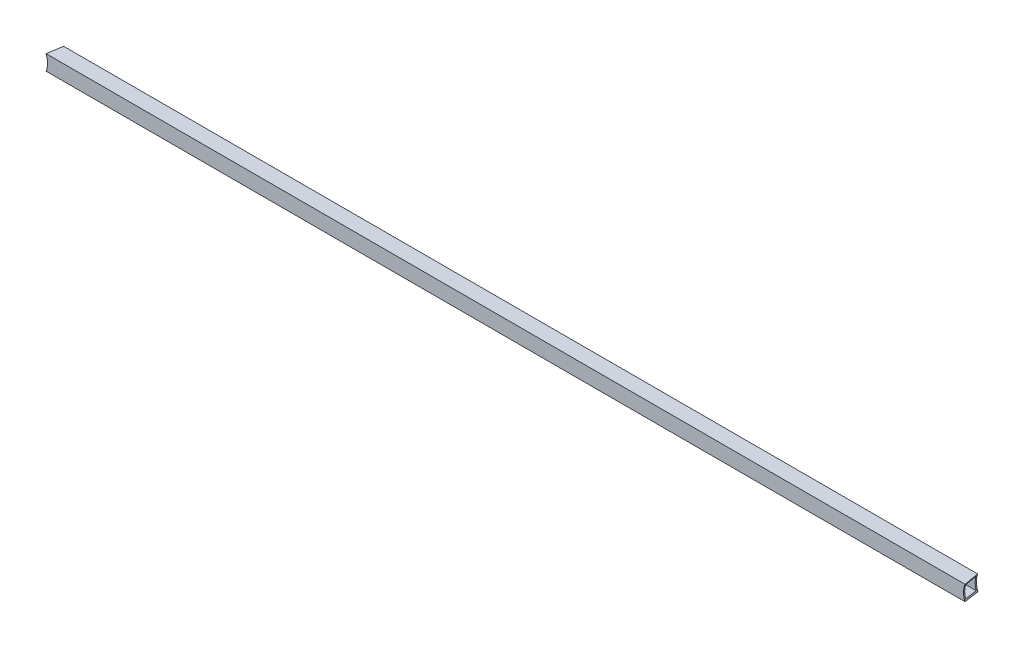
ISO-10303-21;
HEADER;
FILE_DESCRIPTION(('STEP AP214'),'2;1');
FILE_NAME('part.step','',(''),(''),'','','');
FILE_SCHEMA(('AUTOMOTIVE_DESIGN { 1 0 10303 214 1 1 1 1 }'));
ENDSEC;
DATA;
#1=APPLICATION_CONTEXT('core data for automotive mechanical design processes');
#2=APPLICATION_PROTOCOL_DEFINITION('international standard','automotive_design',2000,#1);
#3=PRODUCT_CONTEXT('',#1,'mechanical');
#4=PRODUCT('Part','Part','',(#3));
#5=PRODUCT_RELATED_PRODUCT_CATEGORY('part','',(#4));
#6=PRODUCT_DEFINITION_FORMATION('','',#4);
#7=PRODUCT_DEFINITION_CONTEXT('part definition',#1,'design');
#8=PRODUCT_DEFINITION('design','',#6,#7);
#9=PRODUCT_DEFINITION_SHAPE('','',#8);
#10=(LENGTH_UNIT() NAMED_UNIT(*) SI_UNIT(.MILLI.,.METRE.));
#11=(NAMED_UNIT(*) PLANE_ANGLE_UNIT() SI_UNIT($,.RADIAN.));
#12=(NAMED_UNIT(*) SI_UNIT($,.STERADIAN.) SOLID_ANGLE_UNIT());
#13=UNCERTAINTY_MEASURE_WITH_UNIT(LENGTH_MEASURE(1.E-05),#10,'distance_accuracy_value','');
#14=(GEOMETRIC_REPRESENTATION_CONTEXT(3) GLOBAL_UNCERTAINTY_ASSIGNED_CONTEXT((#13)) GLOBAL_UNIT_ASSIGNED_CONTEXT((#10,
#11,#12)) REPRESENTATION_CONTEXT('',''));
#15=CARTESIAN_POINT('',(0.,0.,0.));
#16=DIRECTION('',(0.,0.,1.));
#17=DIRECTION('',(1.,0.,0.));
#18=AXIS2_PLACEMENT_3D('',#15,#16,#17);
#19=CARTESIAN_POINT('',(299.314079561146,352.955591655442,-564.520506465781));
#20=DIRECTION('',(0.,1.,0.));
#21=DIRECTION('',(0.,0.,1.));
#22=AXIS2_PLACEMENT_3D('',#19,#20,#21);
#23=PLANE('',#22);
#24=DIRECTION('',(-1.,0.,0.));
#25=VECTOR('',#24,1.);
#26=CARTESIAN_POINT('',(299.314079561146,352.955591655442,-556.773506465781));
#27=LINE('',#26,#25);
#28=CARTESIAN_POINT('',(287.650058347241,352.955591655442,-556.773506465781));
#29=VERTEX_POINT('',#28);
#30=CARTESIAN_POINT('',(-287.650058347241,352.955591655442,-556.773506465781));
#31=VERTEX_POINT('',#30);
#32=EDGE_CURVE('E147',#29,#31,#27,.T.);
#33=ORIENTED_EDGE('',*,*,#32,.F.);
#34=CARTESIAN_POINT('',(318.393853823521,352.955591655442,-435.894318112521));
#35=DIRECTION('',(0.,1.,0.));
#36=DIRECTION('',(0.151182856522685,0.,0.988505813788488));
#37=AXIS2_PLACEMENT_3D('',#34,#35,#36);
#38=ELLIPSE('',#37,413.976138648436,12.7);
#39=CARTESIAN_POINT('',(286.544222694846,352.955591655442,-564.520506465781));
#40=VERTEX_POINT('',#39);
#41=EDGE_CURVE('E47',#29,#40,#38,.F.);
#42=ORIENTED_EDGE('',*,*,#41,.T.);
#43=DIRECTION('',(-1.,0.,0.));
#44=VECTOR('',#43,1.);
#45=CARTESIAN_POINT('',(299.314079561146,352.955591655442,-564.520506465781));
#46=LINE('',#45,#44);
#47=CARTESIAN_POINT('',(-286.544222694846,352.955591655442,-564.520506465781));
#48=VERTEX_POINT('',#47);
#49=EDGE_CURVE('E114',#40,#48,#46,.T.);
#50=ORIENTED_EDGE('',*,*,#49,.T.);
#51=CARTESIAN_POINT('',(-318.393853823522,352.955591655442,-435.894318112517));
#52=DIRECTION('',(0.,1.,0.));
#53=DIRECTION('',(-0.151182856522685,0.,0.988505813788488));
#54=AXIS2_PLACEMENT_3D('',#51,#52,#53);
#55=ELLIPSE('',#54,413.976138648436,12.7);
#56=EDGE_CURVE('E103',#48,#31,#55,.F.);
#57=ORIENTED_EDGE('',*,*,#56,.T.);
#58=EDGE_LOOP('',(#33,#42,#50,#57));
#59=FACE_BOUND('',#58,.T.);
#60=ADVANCED_FACE('F43',(#59),#23,.T.);
#61=CARTESIAN_POINT('',(299.314079561146,352.955591655442,-564.520506465781));
#62=DIRECTION('',(0.,0.,1.));
#63=DIRECTION('',(1.,0.,0.));
#64=AXIS2_PLACEMENT_3D('',#61,#62,#63);
#65=PLANE('',#64);
#66=ORIENTED_EDGE('',*,*,#49,.F.);
#67=CARTESIAN_POINT('',(298.721663425022,356.949361626759,-564.520506465781));
#68=DIRECTION('',(0.,0.,1.));
#69=DIRECTION('',(0.980008146933979,-0.198957362123219,0.));
#70=AXIS2_PLACEMENT_3D('',#67,#68,#69);
#71=ELLIPSE('',#70,12.8537235888175,12.7);
#72=CARTESIAN_POINT('',(286.429614297048,360.702591655442,-564.520506465781));
#73=VERTEX_POINT('',#72);
#74=EDGE_CURVE('E113',#40,#73,#71,.F.);
#75=ORIENTED_EDGE('',*,*,#74,.T.);
#76=DIRECTION('',(-1.,0.,0.));
#77=VECTOR('',#76,1.);
#78=CARTESIAN_POINT('',(299.314079561146,360.702591655442,-564.520506465781));
#79=LINE('',#78,#77);
#80=CARTESIAN_POINT('',(-286.429614297048,360.702591655442,-564.520506465781));
#81=VERTEX_POINT('',#80);
#82=EDGE_CURVE('E122',#73,#81,#79,.T.);
#83=ORIENTED_EDGE('',*,*,#82,.T.);
#84=CARTESIAN_POINT('',(-298.721663425022,356.94936162676,-564.520506465781));
#85=DIRECTION('',(0.,0.,1.));
#86=DIRECTION('',(-0.980008146933979,-0.198957362123218,0.));
#87=AXIS2_PLACEMENT_3D('',#84,#85,#86);
#88=ELLIPSE('',#87,12.8537235888175,12.7);
#89=EDGE_CURVE('E99',#81,#48,#88,.F.);
#90=ORIENTED_EDGE('',*,*,#89,.T.);
#91=EDGE_LOOP('',(#66,#75,#83,#90));
#92=FACE_BOUND('',#91,.T.);
#93=ADVANCED_FACE('F119',(#92),#65,.T.);
#94=CARTESIAN_POINT('',(299.314079561146,360.702591655442,-564.520506465781));
#95=DIRECTION('',(0.,-1.,0.));
#96=DIRECTION('',(0.,0.,-1.));
#97=AXIS2_PLACEMENT_3D('',#94,#95,#96);
#98=PLANE('',#97);
#99=ORIENTED_EDGE('',*,*,#82,.F.);
#100=CARTESIAN_POINT('',(280.23430529877,360.702591655442,-685.399694819043));
#101=DIRECTION('',(0.,-1.,0.));
#102=DIRECTION('',(0.151182856522685,0.,0.988505813788488));
#103=AXIS2_PLACEMENT_3D('',#100,#101,#102);
#104=ELLIPSE('',#103,413.976138648436,12.7);
#105=CARTESIAN_POINT('',(287.691160873661,360.702591655442,-556.773506465781));
#106=VERTEX_POINT('',#105);
#107=EDGE_CURVE('E124',#73,#106,#104,.F.);
#108=ORIENTED_EDGE('',*,*,#107,.T.);
#109=DIRECTION('',(-1.,0.,0.));
#110=VECTOR('',#109,1.);
#111=CARTESIAN_POINT('',(299.314079561146,360.702591655442,-556.773506465781));
#112=LINE('',#111,#110);
#113=CARTESIAN_POINT('',(-287.691160873661,360.702591655442,-556.773506465781));
#114=VERTEX_POINT('',#113);
#115=EDGE_CURVE('E138',#106,#114,#112,.T.);
#116=ORIENTED_EDGE('',*,*,#115,.T.);
#117=CARTESIAN_POINT('',(-280.234305298771,360.702591655442,-685.399694819039));
#118=DIRECTION('',(0.,-1.,0.));
#119=DIRECTION('',(-0.151182856522685,0.,0.988505813788488));
#120=AXIS2_PLACEMENT_3D('',#117,#118,#119);
#121=ELLIPSE('',#120,413.976138648436,12.7);
#122=EDGE_CURVE('E142',#114,#81,#121,.F.);
#123=ORIENTED_EDGE('',*,*,#122,.T.);
#124=EDGE_LOOP('',(#99,#108,#116,#123));
#125=FACE_BOUND('',#124,.T.);
#126=ADVANCED_FACE('F222',(#125),#98,.T.);
#127=CARTESIAN_POINT('',(299.314079561146,352.955591655442,-556.773506465781));
#128=DIRECTION('',(0.,0.,-1.));
#129=DIRECTION('',(-1.,0.,0.));
#130=AXIS2_PLACEMENT_3D('',#127,#128,#129);
#131=PLANE('',#130);
#132=ORIENTED_EDGE('',*,*,#115,.F.);
#133=CARTESIAN_POINT('',(299.90649569727,356.708821684125,-556.773506465781));
#134=DIRECTION('',(0.,0.,-1.));
#135=DIRECTION('',(0.980008146933979,-0.198957362123219,0.));
#136=AXIS2_PLACEMENT_3D('',#133,#134,#135);
#137=ELLIPSE('',#136,12.8537235888175,12.7);
#138=EDGE_CURVE('E143',#106,#29,#137,.F.);
#139=ORIENTED_EDGE('',*,*,#138,.T.);
#140=ORIENTED_EDGE('',*,*,#32,.T.);
#141=CARTESIAN_POINT('',(-299.90649569727,356.708821684125,-556.773506465781));
#142=DIRECTION('',(0.,0.,-1.));
#143=DIRECTION('',(-0.980008146933979,-0.198957362123218,0.));
#144=AXIS2_PLACEMENT_3D('',#141,#142,#143);
#145=ELLIPSE('',#144,12.8537235888175,12.7);
#146=EDGE_CURVE('E107',#31,#114,#145,.F.);
#147=ORIENTED_EDGE('',*,*,#146,.T.);
#148=EDGE_LOOP('',(#132,#139,#140,#147));
#149=FACE_BOUND('',#148,.T.);
#150=ADVANCED_FACE('F228',(#149),#131,.T.);
#151=CARTESIAN_POINT('',(-268.329604576393,363.119436719435,-763.238321143161));
#152=DIRECTION('',(-0.151111697234675,-0.0306780966687196,0.98804054033407));
#153=DIRECTION('',(0.988505813788488,0.,0.151182856522685));
#154=AXIS2_PLACEMENT_3D('',#151,#152,#153);
#155=CYLINDRICAL_SURFACE('',#154,12.7);
#156=ORIENTED_EDGE('',*,*,#56,.F.);
#157=ORIENTED_EDGE('',*,*,#89,.F.);
#158=ORIENTED_EDGE('',*,*,#122,.F.);
#159=ORIENTED_EDGE('',*,*,#146,.F.);
#160=EDGE_LOOP('',(#156,#157,#158,#159));
#161=FACE_BOUND('',#160,.T.);
#162=CARTESIAN_POINT('',(-298.585699065912,356.976964570996,-565.409506465781));
#163=DIRECTION('',(0.,0.,1.));
#164=DIRECTION('',(-0.980008146933979,-0.198957362123218,0.));
#165=AXIS2_PLACEMENT_3D('',#162,#163,#164);
#166=ELLIPSE('',#165,12.8537235888175,12.7);
#167=CARTESIAN_POINT('',(-286.593524044193,361.591591655442,-565.409506465781));
#168=VERTEX_POINT('',#167);
#169=CARTESIAN_POINT('',(-286.759621918319,352.066591655442,-565.409506465781));
#170=VERTEX_POINT('',#169);
#171=EDGE_CURVE('E178',#168,#170,#166,.F.);
#172=ORIENTED_EDGE('',*,*,#171,.T.);
#173=CARTESIAN_POINT('',(-322.77281840833,352.066591655442,-407.262553572423));
#174=DIRECTION('',(0.,1.,0.));
#175=DIRECTION('',(-0.151182856522685,0.,0.988505813788488));
#176=AXIS2_PLACEMENT_3D('',#173,#174,#175);
#177=ELLIPSE('',#176,413.976138648436,12.7);
#178=CARTESIAN_POINT('',(-288.094070007544,352.066591655442,-555.884506465781));
#179=VERTEX_POINT('',#178);
#180=EDGE_CURVE('E179',#170,#179,#177,.F.);
#181=ORIENTED_EDGE('',*,*,#180,.T.);
#182=CARTESIAN_POINT('',(-300.04246005638,356.681218739888,-555.884506465781));
#183=DIRECTION('',(0.,0.,-1.));
#184=DIRECTION('',(-0.980008146933979,-0.198957362123218,0.));
#185=AXIS2_PLACEMENT_3D('',#182,#183,#184);
#186=ELLIPSE('',#185,12.8537235888175,12.7);
#187=CARTESIAN_POINT('',(-288.169791810306,361.591591655442,-555.884506465781));
#188=VERTEX_POINT('',#187);
#189=EDGE_CURVE('E182',#179,#188,#186,.F.);
#190=ORIENTED_EDGE('',*,*,#189,.T.);
#191=CARTESIAN_POINT('',(-275.855340713963,361.591591655442,-714.031459359133));
#192=DIRECTION('',(0.,-1.,0.));
#193=DIRECTION('',(-0.151182856522685,0.,0.988505813788488));
#194=AXIS2_PLACEMENT_3D('',#191,#192,#193);
#195=ELLIPSE('',#194,413.976138648436,12.7);
#196=EDGE_CURVE('E154',#188,#168,#195,.F.);
#197=ORIENTED_EDGE('',*,*,#196,.T.);
#198=EDGE_LOOP('',(#172,#181,#190,#197));
#199=FACE_BOUND('',#198,.T.);
#200=ADVANCED_FACE('F104',(#161,#199),#155,.F.);
#201=CARTESIAN_POINT('',(268.329604576393,363.119436719435,-763.238321143161));
#202=DIRECTION('',(0.151111697234675,-0.0306780966687196,0.98804054033407));
#203=DIRECTION('',(0.988505813788488,0.,-0.151182856522685));
#204=AXIS2_PLACEMENT_3D('',#201,#202,#203);
#205=CYLINDRICAL_SURFACE('',#204,12.7);
#206=ORIENTED_EDGE('',*,*,#107,.F.);
#207=ORIENTED_EDGE('',*,*,#74,.F.);
#208=ORIENTED_EDGE('',*,*,#41,.F.);
#209=ORIENTED_EDGE('',*,*,#138,.F.);
#210=EDGE_LOOP('',(#206,#207,#208,#209));
#211=FACE_BOUND('',#210,.T.);
#212=CARTESIAN_POINT('',(298.585699065912,356.976964570996,-565.409506465781));
#213=DIRECTION('',(0.,0.,1.));
#214=DIRECTION('',(0.980008146933979,-0.198957362123219,0.));
#215=AXIS2_PLACEMENT_3D('',#212,#213,#214);
#216=ELLIPSE('',#215,12.8537235888175,12.7);
#217=CARTESIAN_POINT('',(286.75962191832,352.066591655442,-565.409506465781));
#218=VERTEX_POINT('',#217);
#219=CARTESIAN_POINT('',(286.593524044193,361.591591655442,-565.409506465781));
#220=VERTEX_POINT('',#219);
#221=EDGE_CURVE('E150',#218,#220,#216,.F.);
#222=ORIENTED_EDGE('',*,*,#221,.T.);
#223=CARTESIAN_POINT('',(275.855340713962,361.591591655442,-714.031459359137));
#224=DIRECTION('',(0.,-1.,0.));
#225=DIRECTION('',(0.151182856522685,0.,0.988505813788488));
#226=AXIS2_PLACEMENT_3D('',#223,#224,#225);
#227=ELLIPSE('',#226,413.976138648436,12.7);
#228=CARTESIAN_POINT('',(288.169791810306,361.591591655442,-555.884506465781));
#229=VERTEX_POINT('',#228);
#230=EDGE_CURVE('E153',#220,#229,#227,.F.);
#231=ORIENTED_EDGE('',*,*,#230,.T.);
#232=CARTESIAN_POINT('',(300.04246005638,356.681218739888,-555.884506465781));
#233=DIRECTION('',(0.,0.,-1.));
#234=DIRECTION('',(0.980008146933979,-0.198957362123219,0.));
#235=AXIS2_PLACEMENT_3D('',#232,#233,#234);
#236=ELLIPSE('',#235,12.8537235888175,12.7);
#237=CARTESIAN_POINT('',(288.094070007544,352.066591655442,-555.884506465781));
#238=VERTEX_POINT('',#237);
#239=EDGE_CURVE('E158',#229,#238,#236,.F.);
#240=ORIENTED_EDGE('',*,*,#239,.T.);
#241=CARTESIAN_POINT('',(322.772818408329,352.066591655442,-407.262553572427));
#242=DIRECTION('',(0.,1.,0.));
#243=DIRECTION('',(0.151182856522685,0.,0.988505813788488));
#244=AXIS2_PLACEMENT_3D('',#241,#242,#243);
#245=ELLIPSE('',#244,413.976138648436,12.7);
#246=EDGE_CURVE('E63',#238,#218,#245,.F.);
#247=ORIENTED_EDGE('',*,*,#246,.T.);
#248=EDGE_LOOP('',(#222,#231,#240,#247));
#249=FACE_BOUND('',#248,.T.);
#250=ADVANCED_FACE('F203',(#211,#249),#205,.F.);
#251=CARTESIAN_POINT('',(299.314079561146,352.066591655442,-555.884506465781));
#252=DIRECTION('',(0.,1.,0.));
#253=DIRECTION('',(0.,0.,1.));
#254=AXIS2_PLACEMENT_3D('',#251,#252,#253);
#255=PLANE('',#254);
#256=ORIENTED_EDGE('',*,*,#246,.F.);
#257=DIRECTION('',(-1.,0.,0.));
#258=VECTOR('',#257,1.);
#259=CARTESIAN_POINT('',(299.314079561146,352.066591655442,-555.884506465781));
#260=LINE('',#259,#258);
#261=EDGE_CURVE('E163',#238,#179,#260,.T.);
#262=ORIENTED_EDGE('',*,*,#261,.T.);
#263=ORIENTED_EDGE('',*,*,#180,.F.);
#264=DIRECTION('',(-1.,0.,0.));
#265=VECTOR('',#264,1.);
#266=CARTESIAN_POINT('',(299.314079561146,352.066591655442,-565.409506465781));
#267=LINE('',#266,#265);
#268=EDGE_CURVE('E11',#218,#170,#267,.T.);
#269=ORIENTED_EDGE('',*,*,#268,.F.);
#270=EDGE_LOOP('',(#256,#262,#263,#269));
#271=FACE_BOUND('',#270,.T.);
#272=ADVANCED_FACE('F199',(#271),#255,.F.);
#273=CARTESIAN_POINT('',(299.314079561146,352.066591655442,-555.884506465781));
#274=DIRECTION('',(0.,0.,-1.));
#275=DIRECTION('',(-1.,0.,0.));
#276=AXIS2_PLACEMENT_3D('',#273,#274,#275);
#277=PLANE('',#276);
#278=ORIENTED_EDGE('',*,*,#239,.F.);
#279=DIRECTION('',(-1.,0.,0.));
#280=VECTOR('',#279,1.);
#281=CARTESIAN_POINT('',(299.314079561146,361.591591655442,-555.884506465781));
#282=LINE('',#281,#280);
#283=EDGE_CURVE('E167',#229,#188,#282,.T.);
#284=ORIENTED_EDGE('',*,*,#283,.T.);
#285=ORIENTED_EDGE('',*,*,#189,.F.);
#286=ORIENTED_EDGE('',*,*,#261,.F.);
#287=EDGE_LOOP('',(#278,#284,#285,#286));
#288=FACE_BOUND('',#287,.T.);
#289=ADVANCED_FACE('F208',(#288),#277,.F.);
#290=CARTESIAN_POINT('',(299.314079561146,361.591591655442,-555.884506465781));
#291=DIRECTION('',(0.,-1.,0.));
#292=DIRECTION('',(0.,0.,-1.));
#293=AXIS2_PLACEMENT_3D('',#290,#291,#292);
#294=PLANE('',#293);
#295=ORIENTED_EDGE('',*,*,#230,.F.);
#296=DIRECTION('',(-1.,0.,0.));
#297=VECTOR('',#296,1.);
#298=CARTESIAN_POINT('',(299.314079561146,361.591591655442,-565.409506465781));
#299=LINE('',#298,#297);
#300=EDGE_CURVE('E54',#220,#168,#299,.T.);
#301=ORIENTED_EDGE('',*,*,#300,.T.);
#302=ORIENTED_EDGE('',*,*,#196,.F.);
#303=ORIENTED_EDGE('',*,*,#283,.F.);
#304=EDGE_LOOP('',(#295,#301,#302,#303));
#305=FACE_BOUND('',#304,.T.);
#306=ADVANCED_FACE('F45',(#305),#294,.F.);
#307=CARTESIAN_POINT('',(299.314079561146,352.066591655442,-565.409506465781));
#308=DIRECTION('',(0.,0.,1.));
#309=DIRECTION('',(1.,0.,0.));
#310=AXIS2_PLACEMENT_3D('',#307,#308,#309);
#311=PLANE('',#310);
#312=ORIENTED_EDGE('',*,*,#221,.F.);
#313=ORIENTED_EDGE('',*,*,#268,.T.);
#314=ORIENTED_EDGE('',*,*,#171,.F.);
#315=ORIENTED_EDGE('',*,*,#300,.F.);
#316=EDGE_LOOP('',(#312,#313,#314,#315));
#317=FACE_BOUND('',#316,.T.);
#318=ADVANCED_FACE('F201',(#317),#311,.F.);
#319=CLOSED_SHELL('',(#60,#93,#126,#150,#200,#250,#272,#289,#306,#318));
#320=MANIFOLD_SOLID_BREP('B2',#319);
#321=ADVANCED_BREP_SHAPE_REPRESENTATION('',(#18,#320),#14);
#322=SHAPE_DEFINITION_REPRESENTATION(#9,#321);
ENDSEC;
END-ISO-10303-21;
